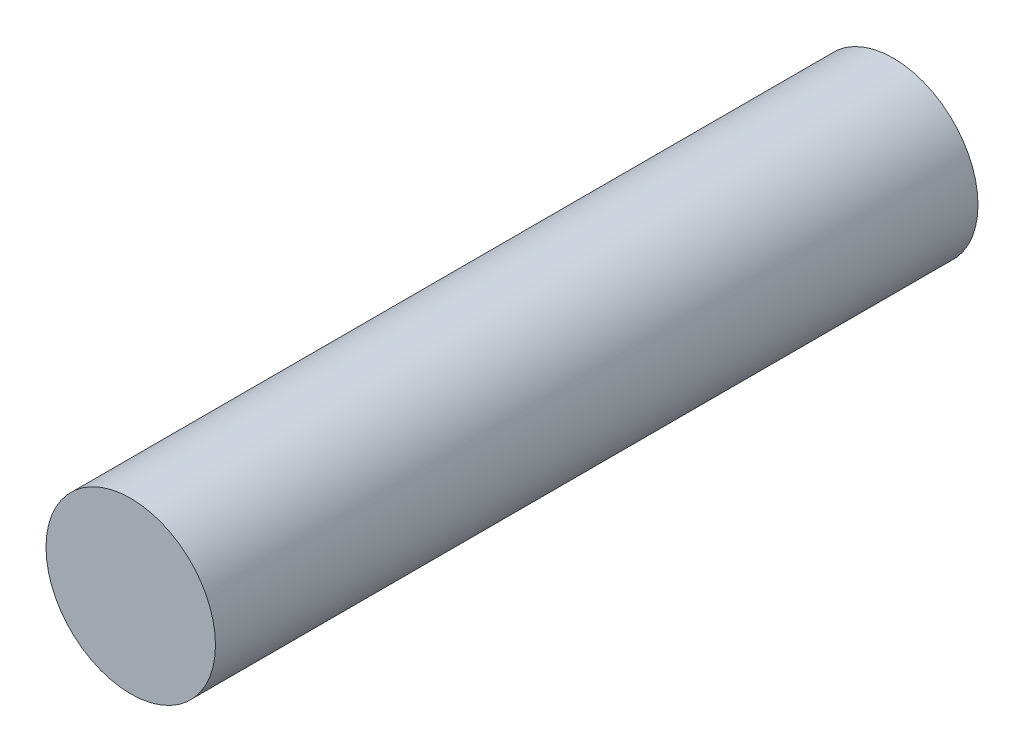
ISO-10303-21;
HEADER;
FILE_DESCRIPTION(('STEP AP214'),'2;1');
FILE_NAME('part.step','',(''),(''),'','','');
FILE_SCHEMA(('AUTOMOTIVE_DESIGN { 1 0 10303 214 1 1 1 1 }'));
ENDSEC;
DATA;
#1=APPLICATION_CONTEXT('core data for automotive mechanical design processes');
#2=APPLICATION_PROTOCOL_DEFINITION('international standard','automotive_design',2000,#1);
#3=PRODUCT_CONTEXT('',#1,'mechanical');
#4=PRODUCT('Part','Part','',(#3));
#5=PRODUCT_RELATED_PRODUCT_CATEGORY('part','',(#4));
#6=PRODUCT_DEFINITION_FORMATION('','',#4);
#7=PRODUCT_DEFINITION_CONTEXT('part definition',#1,'design');
#8=PRODUCT_DEFINITION('design','',#6,#7);
#9=PRODUCT_DEFINITION_SHAPE('','',#8);
#10=(LENGTH_UNIT() NAMED_UNIT(*) SI_UNIT(.MILLI.,.METRE.));
#11=(NAMED_UNIT(*) PLANE_ANGLE_UNIT() SI_UNIT($,.RADIAN.));
#12=(NAMED_UNIT(*) SI_UNIT($,.STERADIAN.) SOLID_ANGLE_UNIT());
#13=UNCERTAINTY_MEASURE_WITH_UNIT(LENGTH_MEASURE(1.E-05),#10,'distance_accuracy_value','');
#14=(GEOMETRIC_REPRESENTATION_CONTEXT(3) GLOBAL_UNCERTAINTY_ASSIGNED_CONTEXT((#13)) GLOBAL_UNIT_ASSIGNED_CONTEXT((#10,
#11,#12)) REPRESENTATION_CONTEXT('',''));
#15=CARTESIAN_POINT('',(0.,0.,0.));
#16=DIRECTION('',(0.,0.,1.));
#17=DIRECTION('',(1.,0.,0.));
#18=AXIS2_PLACEMENT_3D('',#15,#16,#17);
#19=CARTESIAN_POINT('',(0.,0.,25.));
#20=DIRECTION('',(0.,0.,-1.));
#21=DIRECTION('',(-1.,0.,0.));
#22=AXIS2_PLACEMENT_3D('',#19,#20,#21);
#23=CYLINDRICAL_SURFACE('',#22,2.778125);
#24=CARTESIAN_POINT('',(0.,0.,25.));
#25=DIRECTION('',(0.,0.,1.));
#26=DIRECTION('',(1.,0.,0.));
#27=AXIS2_PLACEMENT_3D('',#24,#25,#26);
#28=CIRCLE('',#27,2.778125);
#29=CARTESIAN_POINT('',(2.778125,0.,25.));
#30=VERTEX_POINT('',#29);
#31=EDGE_CURVE('E10',#30,#30,#28,.T.);
#32=ORIENTED_EDGE('',*,*,#31,.F.);
#33=EDGE_LOOP('',(#32));
#34=FACE_BOUND('',#33,.T.);
#35=CARTESIAN_POINT('',(0.,0.,0.));
#36=DIRECTION('',(0.,0.,1.));
#37=DIRECTION('',(1.,0.,0.));
#38=AXIS2_PLACEMENT_3D('',#35,#36,#37);
#39=CIRCLE('',#38,2.778125);
#40=CARTESIAN_POINT('',(2.778125,0.,0.));
#41=VERTEX_POINT('',#40);
#42=EDGE_CURVE('E48',#41,#41,#39,.T.);
#43=ORIENTED_EDGE('',*,*,#42,.T.);
#44=EDGE_LOOP('',(#43));
#45=FACE_BOUND('',#44,.T.);
#46=ADVANCED_FACE('F45',(#34,#45),#23,.T.);
#47=CARTESIAN_POINT('',(0.,0.,25.));
#48=DIRECTION('',(0.,0.,1.));
#49=DIRECTION('',(1.,0.,0.));
#50=AXIS2_PLACEMENT_3D('',#47,#48,#49);
#51=PLANE('',#50);
#52=ORIENTED_EDGE('',*,*,#31,.T.);
#53=EDGE_LOOP('',(#52));
#54=FACE_BOUND('',#53,.T.);
#55=ADVANCED_FACE('F62',(#54),#51,.T.);
#56=CARTESIAN_POINT('',(0.,0.,0.));
#57=DIRECTION('',(0.,0.,1.));
#58=DIRECTION('',(1.,0.,0.));
#59=AXIS2_PLACEMENT_3D('',#56,#57,#58);
#60=PLANE('',#59);
#61=ORIENTED_EDGE('',*,*,#42,.F.);
#62=EDGE_LOOP('',(#61));
#63=FACE_BOUND('',#62,.T.);
#64=ADVANCED_FACE('F60',(#63),#60,.F.);
#65=CLOSED_SHELL('',(#46,#55,#64));
#66=MANIFOLD_SOLID_BREP('B2',#65);
#67=ADVANCED_BREP_SHAPE_REPRESENTATION('',(#18,#66),#14);
#68=SHAPE_DEFINITION_REPRESENTATION(#9,#67);
ENDSEC;
END-ISO-10303-21;
